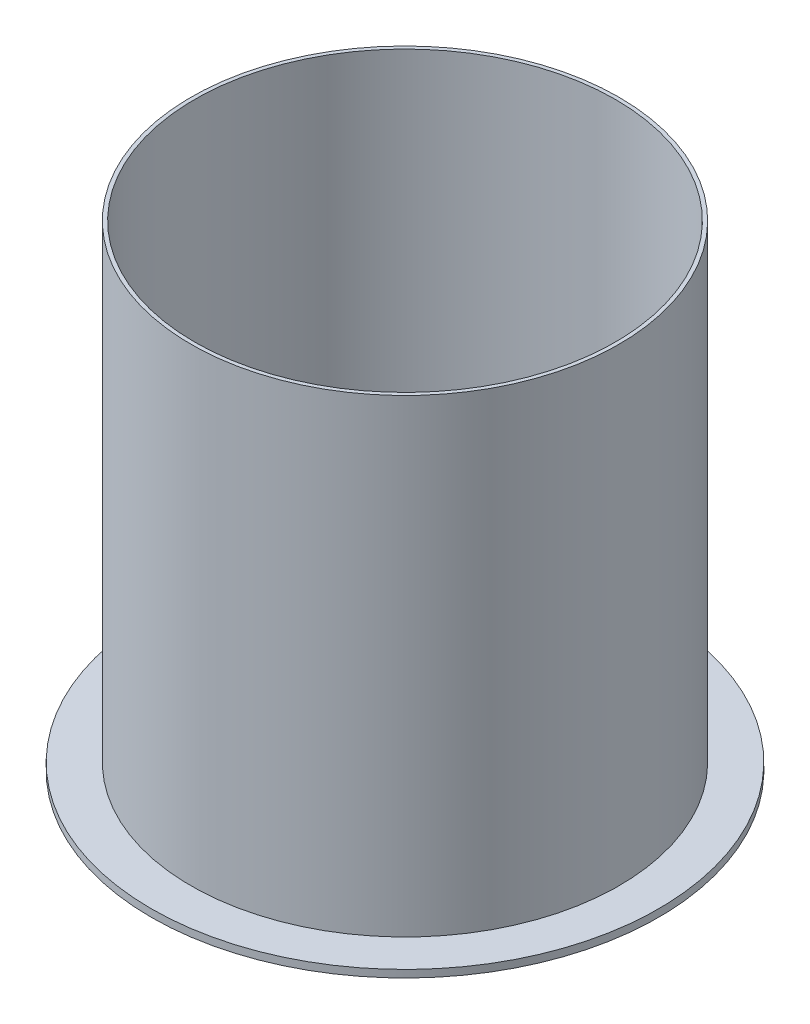
ISO-10303-21;
HEADER;
FILE_DESCRIPTION(('STEP AP214'),'2;1');
FILE_NAME('part.step','',(''),(''),'','','');
FILE_SCHEMA(('AUTOMOTIVE_DESIGN { 1 0 10303 214 1 1 1 1 }'));
ENDSEC;
DATA;
#1=APPLICATION_CONTEXT('core data for automotive mechanical design processes');
#2=APPLICATION_PROTOCOL_DEFINITION('international standard','automotive_design',2000,#1);
#3=PRODUCT_CONTEXT('',#1,'mechanical');
#4=PRODUCT('Part','Part','',(#3));
#5=PRODUCT_RELATED_PRODUCT_CATEGORY('part','',(#4));
#6=PRODUCT_DEFINITION_FORMATION('','',#4);
#7=PRODUCT_DEFINITION_CONTEXT('part definition',#1,'design');
#8=PRODUCT_DEFINITION('design','',#6,#7);
#9=PRODUCT_DEFINITION_SHAPE('','',#8);
#10=(LENGTH_UNIT() NAMED_UNIT(*) SI_UNIT(.MILLI.,.METRE.));
#11=(NAMED_UNIT(*) PLANE_ANGLE_UNIT() SI_UNIT($,.RADIAN.));
#12=(NAMED_UNIT(*) SI_UNIT($,.STERADIAN.) SOLID_ANGLE_UNIT());
#13=UNCERTAINTY_MEASURE_WITH_UNIT(LENGTH_MEASURE(1.E-05),#10,'distance_accuracy_value','');
#14=(GEOMETRIC_REPRESENTATION_CONTEXT(3) GLOBAL_UNCERTAINTY_ASSIGNED_CONTEXT((#13)) GLOBAL_UNIT_ASSIGNED_CONTEXT((#10,
#11,#12)) REPRESENTATION_CONTEXT('',''));
#15=CARTESIAN_POINT('',(0.,0.,0.));
#16=DIRECTION('',(0.,0.,1.));
#17=DIRECTION('',(1.,0.,0.));
#18=AXIS2_PLACEMENT_3D('',#15,#16,#17);
#19=CARTESIAN_POINT('',(0.,2438.4,0.));
#20=DIRECTION('',(0.,1.,0.));
#21=DIRECTION('',(0.,0.,1.));
#22=AXIS2_PLACEMENT_3D('',#19,#20,#21);
#23=PLANE('',#22);
#24=CARTESIAN_POINT('',(0.,2438.4,0.));
#25=DIRECTION('',(0.,1.,0.));
#26=DIRECTION('',(0.,0.,1.));
#27=AXIS2_PLACEMENT_3D('',#24,#25,#26);
#28=CIRCLE('',#27,1095.375);
#29=CARTESIAN_POINT('',(0.,2438.4,-1095.375));
#30=VERTEX_POINT('',#29);
#31=EDGE_CURVE('E10',#30,#30,#28,.T.);
#32=ORIENTED_EDGE('',*,*,#31,.T.);
#33=EDGE_LOOP('',(#32));
#34=FACE_BOUND('',#33,.T.);
#35=CARTESIAN_POINT('',(0.,2438.4,0.));
#36=DIRECTION('',(0.,1.,0.));
#37=DIRECTION('',(0.,0.,1.));
#38=AXIS2_PLACEMENT_3D('',#35,#36,#37);
#39=CIRCLE('',#38,1076.325);
#40=CARTESIAN_POINT('',(0.,2438.4,-1076.325));
#41=VERTEX_POINT('',#40);
#42=EDGE_CURVE('E44',#41,#41,#39,.T.);
#43=ORIENTED_EDGE('',*,*,#42,.F.);
#44=EDGE_LOOP('',(#43));
#45=FACE_BOUND('',#44,.T.);
#46=ADVANCED_FACE('F37',(#34,#45),#23,.T.);
#47=CARTESIAN_POINT('',(0.,0.,0.));
#48=DIRECTION('',(0.,1.,0.));
#49=DIRECTION('',(0.,0.,1.));
#50=AXIS2_PLACEMENT_3D('',#47,#48,#49);
#51=PLANE('',#50);
#52=CARTESIAN_POINT('',(0.,0.,0.));
#53=DIRECTION('',(0.,1.,0.));
#54=DIRECTION('',(0.,0.,1.));
#55=AXIS2_PLACEMENT_3D('',#52,#53,#54);
#56=CIRCLE('',#55,1076.325);
#57=CARTESIAN_POINT('',(0.,0.,-1076.325));
#58=VERTEX_POINT('',#57);
#59=EDGE_CURVE('E48',#58,#58,#56,.T.);
#60=ORIENTED_EDGE('',*,*,#59,.T.);
#61=EDGE_LOOP('',(#60));
#62=FACE_BOUND('',#61,.T.);
#63=CARTESIAN_POINT('',(0.,0.,0.));
#64=DIRECTION('',(0.,1.,0.));
#65=DIRECTION('',(0.,0.,1.));
#66=AXIS2_PLACEMENT_3D('',#63,#64,#65);
#67=CIRCLE('',#66,1298.575);
#68=CARTESIAN_POINT('',(0.,0.,-1298.575));
#69=VERTEX_POINT('',#68);
#70=EDGE_CURVE('E58',#69,#69,#67,.T.);
#71=ORIENTED_EDGE('',*,*,#70,.F.);
#72=EDGE_LOOP('',(#71));
#73=FACE_BOUND('',#72,.T.);
#74=ADVANCED_FACE('F73',(#62,#73),#51,.F.);
#75=CARTESIAN_POINT('',(0.,2438.4,0.));
#76=DIRECTION('',(0.,-1.,0.));
#77=DIRECTION('',(0.,0.,-1.));
#78=AXIS2_PLACEMENT_3D('',#75,#76,#77);
#79=CYLINDRICAL_SURFACE('',#78,1095.375);
#80=CARTESIAN_POINT('',(0.,38.1,0.));
#81=DIRECTION('',(0.,1.,0.));
#82=DIRECTION('',(0.,0.,1.));
#83=AXIS2_PLACEMENT_3D('',#80,#81,#82);
#84=CIRCLE('',#83,1095.375);
#85=CARTESIAN_POINT('',(0.,38.1,-1095.375));
#86=VERTEX_POINT('',#85);
#87=EDGE_CURVE('E53',#86,#86,#84,.T.);
#88=CARTESIAN_POINT('',(0.,38.1,-1095.375));
#89=CARTESIAN_POINT('',(0.,63.103125,-1095.375));
#90=CARTESIAN_POINT('',(0.,88.10625,-1095.375));
#91=CARTESIAN_POINT('',(0.,138.1125,-1095.375));
#92=CARTESIAN_POINT('',(0.,163.115625,-1095.375));
#93=CARTESIAN_POINT('',(0.,213.121875,-1095.375));
#94=CARTESIAN_POINT('',(0.,238.125,-1095.375));
#95=CARTESIAN_POINT('',(0.,288.13125,-1095.375));
#96=CARTESIAN_POINT('',(0.,313.134375,-1095.375));
#97=CARTESIAN_POINT('',(0.,363.140625,-1095.375));
#98=CARTESIAN_POINT('',(0.,388.14375,-1095.375));
#99=CARTESIAN_POINT('',(0.,438.15,-1095.375));
#100=CARTESIAN_POINT('',(0.,463.153125,-1095.375));
#101=CARTESIAN_POINT('',(0.,513.159375,-1095.375));
#102=CARTESIAN_POINT('',(0.,538.1625,-1095.375));
#103=CARTESIAN_POINT('',(0.,588.16875,-1095.375));
#104=CARTESIAN_POINT('',(0.,613.171875,-1095.375));
#105=CARTESIAN_POINT('',(0.,663.178125,-1095.375));
#106=CARTESIAN_POINT('',(0.,688.18125,-1095.375));
#107=CARTESIAN_POINT('',(0.,738.1875,-1095.375));
#108=CARTESIAN_POINT('',(0.,763.190625,-1095.375));
#109=CARTESIAN_POINT('',(0.,813.196875,-1095.375));
#110=CARTESIAN_POINT('',(0.,838.2,-1095.375));
#111=CARTESIAN_POINT('',(0.,888.20625,-1095.375));
#112=CARTESIAN_POINT('',(0.,913.209375,-1095.375));
#113=CARTESIAN_POINT('',(0.,963.215625,-1095.375));
#114=CARTESIAN_POINT('',(0.,988.21875,-1095.375));
#115=CARTESIAN_POINT('',(0.,1038.225,-1095.375));
#116=CARTESIAN_POINT('',(0.,1063.228125,-1095.375));
#117=CARTESIAN_POINT('',(0.,1113.234375,-1095.375));
#118=CARTESIAN_POINT('',(0.,1138.2375,-1095.375));
#119=CARTESIAN_POINT('',(0.,1188.24375,-1095.375));
#120=CARTESIAN_POINT('',(0.,1213.246875,-1095.375));
#121=CARTESIAN_POINT('',(0.,1263.253125,-1095.375));
#122=CARTESIAN_POINT('',(0.,1288.25625,-1095.375));
#123=CARTESIAN_POINT('',(0.,1338.2625,-1095.375));
#124=CARTESIAN_POINT('',(0.,1363.265625,-1095.375));
#125=CARTESIAN_POINT('',(0.,1413.271875,-1095.375));
#126=CARTESIAN_POINT('',(0.,1438.275,-1095.375));
#127=CARTESIAN_POINT('',(0.,1488.28125,-1095.375));
#128=CARTESIAN_POINT('',(0.,1513.284375,-1095.375));
#129=CARTESIAN_POINT('',(0.,1563.290625,-1095.375));
#130=CARTESIAN_POINT('',(0.,1588.29375,-1095.375));
#131=CARTESIAN_POINT('',(0.,1638.3,-1095.375));
#132=CARTESIAN_POINT('',(0.,1663.303125,-1095.375));
#133=CARTESIAN_POINT('',(0.,1713.309375,-1095.375));
#134=CARTESIAN_POINT('',(0.,1738.3125,-1095.375));
#135=CARTESIAN_POINT('',(0.,1788.31875,-1095.375));
#136=CARTESIAN_POINT('',(0.,1813.321875,-1095.375));
#137=CARTESIAN_POINT('',(0.,1863.328125,-1095.375));
#138=CARTESIAN_POINT('',(0.,1888.33125,-1095.375));
#139=CARTESIAN_POINT('',(0.,1938.3375,-1095.375));
#140=CARTESIAN_POINT('',(0.,1963.340625,-1095.375));
#141=CARTESIAN_POINT('',(0.,2013.346875,-1095.375));
#142=CARTESIAN_POINT('',(0.,2038.35,-1095.375));
#143=CARTESIAN_POINT('',(0.,2088.35625,-1095.375));
#144=CARTESIAN_POINT('',(0.,2113.359375,-1095.375));
#145=CARTESIAN_POINT('',(0.,2163.365625,-1095.375));
#146=CARTESIAN_POINT('',(0.,2188.36875,-1095.375));
#147=CARTESIAN_POINT('',(0.,2238.375,-1095.375));
#148=CARTESIAN_POINT('',(0.,2263.378125,-1095.375));
#149=CARTESIAN_POINT('',(0.,2313.384375,-1095.375));
#150=CARTESIAN_POINT('',(0.,2338.3875,-1095.375));
#151=CARTESIAN_POINT('',(0.,2388.39375,-1095.375));
#152=CARTESIAN_POINT('',(0.,2413.396875,-1095.375));
#153=CARTESIAN_POINT('',(0.,2438.4,-1095.375));
#154=B_SPLINE_CURVE_WITH_KNOTS('',3,(#88,#89,#90,#91,#92,#93,#94,#95,#96,#97,#98,#99,#100,#101,
#102,#103,#104,#105,#106,#107,#108,#109,#110,#111,#112,#113,#114,#115,#116,#117,#118,#119,#120,
#121,#122,#123,#124,#125,#126,#127,#128,#129,#130,#131,#132,#133,#134,#135,#136,#137,#138,#139,
#140,#141,#142,#143,#144,#145,#146,#147,#148,#149,#150,#151,#152,#153),.UNSPECIFIED.,.F.,.F.,(4,
2,2,2,2,2,2,2,2,2,2,2,2,2,2,2,2,2,2,2,2,2,2,2,2,2,2,2,2,2,2,2,4),(0.,75.009375,150.01875,
225.028125,300.0375,375.046875,450.05625,525.065625,600.075,675.084375,750.09375,825.103125,
900.1125,975.121875,1050.13125,1125.140625,1200.15,1275.159375,1350.16875,1425.178125,1500.1875,
1575.196875,1650.20625,1725.215625,1800.225,1875.234375,1950.24375,2025.253125,2100.2625,
2175.271875,2250.28125,2325.290625,2400.3),.UNSPECIFIED.);
#155=EDGE_CURVE('BSEAM39',#86,#30,#154,.T.);
#156=ORIENTED_EDGE('',*,*,#87,.T.);
#157=ORIENTED_EDGE('',*,*,#31,.F.);
#158=ORIENTED_EDGE('',*,*,#155,.T.);
#159=ORIENTED_EDGE('',*,*,#155,.F.);
#160=EDGE_LOOP('',(#156,#158,#157,#159));
#161=FACE_BOUND('',#160,.T.);
#162=ADVANCED_FACE('F39',(#161),#79,.T.);
#163=CARTESIAN_POINT('',(0.,2438.4,0.));
#164=DIRECTION('',(0.,-1.,0.));
#165=DIRECTION('',(0.,0.,-1.));
#166=AXIS2_PLACEMENT_3D('',#163,#164,#165);
#167=CYLINDRICAL_SURFACE('',#166,1076.325);
#168=CARTESIAN_POINT('',(0.,2438.4,-1076.325));
#169=CARTESIAN_POINT('',(0.,2413.,-1076.325));
#170=CARTESIAN_POINT('',(0.,2387.6,-1076.325));
#171=CARTESIAN_POINT('',(0.,2336.8,-1076.325));
#172=CARTESIAN_POINT('',(0.,2311.4,-1076.325));
#173=CARTESIAN_POINT('',(0.,2260.6,-1076.325));
#174=CARTESIAN_POINT('',(0.,2235.2,-1076.325));
#175=CARTESIAN_POINT('',(0.,2184.4,-1076.325));
#176=CARTESIAN_POINT('',(0.,2159.,-1076.325));
#177=CARTESIAN_POINT('',(0.,2108.2,-1076.325));
#178=CARTESIAN_POINT('',(0.,2082.8,-1076.325));
#179=CARTESIAN_POINT('',(0.,2032.,-1076.325));
#180=CARTESIAN_POINT('',(0.,2006.6,-1076.325));
#181=CARTESIAN_POINT('',(0.,1955.8,-1076.325));
#182=CARTESIAN_POINT('',(0.,1930.4,-1076.325));
#183=CARTESIAN_POINT('',(0.,1879.6,-1076.325));
#184=CARTESIAN_POINT('',(0.,1854.2,-1076.325));
#185=CARTESIAN_POINT('',(0.,1803.4,-1076.325));
#186=CARTESIAN_POINT('',(0.,1778.,-1076.325));
#187=CARTESIAN_POINT('',(0.,1727.2,-1076.325));
#188=CARTESIAN_POINT('',(0.,1701.8,-1076.325));
#189=CARTESIAN_POINT('',(0.,1651.,-1076.325));
#190=CARTESIAN_POINT('',(0.,1625.6,-1076.325));
#191=CARTESIAN_POINT('',(0.,1574.8,-1076.325));
#192=CARTESIAN_POINT('',(0.,1549.4,-1076.325));
#193=CARTESIAN_POINT('',(0.,1498.6,-1076.325));
#194=CARTESIAN_POINT('',(0.,1473.2,-1076.325));
#195=CARTESIAN_POINT('',(0.,1422.4,-1076.325));
#196=CARTESIAN_POINT('',(0.,1397.,-1076.325));
#197=CARTESIAN_POINT('',(0.,1346.2,-1076.325));
#198=CARTESIAN_POINT('',(0.,1320.8,-1076.325));
#199=CARTESIAN_POINT('',(0.,1270.,-1076.325));
#200=CARTESIAN_POINT('',(0.,1244.6,-1076.325));
#201=CARTESIAN_POINT('',(0.,1193.8,-1076.325));
#202=CARTESIAN_POINT('',(0.,1168.4,-1076.325));
#203=CARTESIAN_POINT('',(0.,1117.6,-1076.325));
#204=CARTESIAN_POINT('',(0.,1092.2,-1076.325));
#205=CARTESIAN_POINT('',(0.,1041.4,-1076.325));
#206=CARTESIAN_POINT('',(0.,1016.,-1076.325));
#207=CARTESIAN_POINT('',(0.,965.2,-1076.325));
#208=CARTESIAN_POINT('',(0.,939.8,-1076.325));
#209=CARTESIAN_POINT('',(0.,889.,-1076.325));
#210=CARTESIAN_POINT('',(0.,863.6,-1076.325));
#211=CARTESIAN_POINT('',(0.,812.8,-1076.325));
#212=CARTESIAN_POINT('',(0.,787.4,-1076.325));
#213=CARTESIAN_POINT('',(0.,736.6,-1076.325));
#214=CARTESIAN_POINT('',(0.,711.2,-1076.325));
#215=CARTESIAN_POINT('',(0.,660.4,-1076.325));
#216=CARTESIAN_POINT('',(0.,635.,-1076.325));
#217=CARTESIAN_POINT('',(0.,584.2,-1076.325));
#218=CARTESIAN_POINT('',(0.,558.8,-1076.325));
#219=CARTESIAN_POINT('',(0.,508.,-1076.325));
#220=CARTESIAN_POINT('',(0.,482.6,-1076.325));
#221=CARTESIAN_POINT('',(0.,431.8,-1076.325));
#222=CARTESIAN_POINT('',(0.,406.4,-1076.325));
#223=CARTESIAN_POINT('',(0.,355.6,-1076.325));
#224=CARTESIAN_POINT('',(0.,330.2,-1076.325));
#225=CARTESIAN_POINT('',(0.,279.4,-1076.325));
#226=CARTESIAN_POINT('',(0.,254.,-1076.325));
#227=CARTESIAN_POINT('',(0.,203.2,-1076.325));
#228=CARTESIAN_POINT('',(0.,177.8,-1076.325));
#229=CARTESIAN_POINT('',(0.,127.,-1076.325));
#230=CARTESIAN_POINT('',(0.,101.6,-1076.325));
#231=CARTESIAN_POINT('',(0.,50.8,-1076.325));
#232=CARTESIAN_POINT('',(0.,25.4,-1076.325));
#233=CARTESIAN_POINT('',(0.,0.,-1076.325));
#234=B_SPLINE_CURVE_WITH_KNOTS('',3,(#168,#169,#170,#171,#172,#173,#174,#175,#176,#177,#178,
#179,#180,#181,#182,#183,#184,#185,#186,#187,#188,#189,#190,#191,#192,#193,#194,#195,#196,#197,
#198,#199,#200,#201,#202,#203,#204,#205,#206,#207,#208,#209,#210,#211,#212,#213,#214,#215,#216,
#217,#218,#219,#220,#221,#222,#223,#224,#225,#226,#227,#228,#229,#230,#231,#232,#233),
.UNSPECIFIED.,.F.,.F.,(4,2,2,2,2,2,2,2,2,2,2,2,2,2,2,2,2,2,2,2,2,2,2,2,2,2,2,2,2,2,2,2,4),(0.,
76.1999999999996,152.4,228.6,304.8,381.,457.2,533.4,609.6,685.8,762.,838.2,914.4,990.6,1066.8,
1143.,1219.2,1295.4,1371.6,1447.8,1524.,1600.2,1676.4,1752.6,1828.8,1905.,1981.2,2057.4,2133.6,
2209.8,2286.,2362.2,2438.4),.UNSPECIFIED.);
#235=EDGE_CURVE('BSEAM80',#41,#58,#234,.T.);
#236=ORIENTED_EDGE('',*,*,#42,.T.);
#237=ORIENTED_EDGE('',*,*,#59,.F.);
#238=ORIENTED_EDGE('',*,*,#235,.T.);
#239=ORIENTED_EDGE('',*,*,#235,.F.);
#240=EDGE_LOOP('',(#236,#238,#237,#239));
#241=FACE_BOUND('',#240,.T.);
#242=ADVANCED_FACE('F80',(#241),#167,.F.);
#243=CARTESIAN_POINT('',(0.,38.1,0.));
#244=DIRECTION('',(0.,1.,0.));
#245=DIRECTION('',(0.,0.,1.));
#246=AXIS2_PLACEMENT_3D('',#243,#244,#245);
#247=PLANE('',#246);
#248=CARTESIAN_POINT('',(0.,38.1,0.));
#249=DIRECTION('',(0.,1.,0.));
#250=DIRECTION('',(0.,0.,1.));
#251=AXIS2_PLACEMENT_3D('',#248,#249,#250);
#252=CIRCLE('',#251,1298.575);
#253=CARTESIAN_POINT('',(0.,38.1,-1298.575));
#254=VERTEX_POINT('',#253);
#255=EDGE_CURVE('E57',#254,#254,#252,.T.);
#256=ORIENTED_EDGE('',*,*,#255,.T.);
#257=EDGE_LOOP('',(#256));
#258=FACE_BOUND('',#257,.T.);
#259=ORIENTED_EDGE('',*,*,#87,.F.);
#260=EDGE_LOOP('',(#259));
#261=FACE_BOUND('',#260,.T.);
#262=ADVANCED_FACE('F64',(#258,#261),#247,.T.);
#263=CARTESIAN_POINT('',(0.,38.1,0.));
#264=DIRECTION('',(0.,-1.,0.));
#265=DIRECTION('',(0.,0.,-1.));
#266=AXIS2_PLACEMENT_3D('',#263,#264,#265);
#267=CYLINDRICAL_SURFACE('',#266,1298.575);
#268=CARTESIAN_POINT('',(0.,38.1,-1298.575));
#269=CARTESIAN_POINT('',(0.,37.703125,-1298.575));
#270=CARTESIAN_POINT('',(0.,37.30625,-1298.575));
#271=CARTESIAN_POINT('',(0.,36.5125,-1298.575));
#272=CARTESIAN_POINT('',(0.,36.115625,-1298.575));
#273=CARTESIAN_POINT('',(0.,35.321875,-1298.575));
#274=CARTESIAN_POINT('',(0.,34.925,-1298.575));
#275=CARTESIAN_POINT('',(0.,34.13125,-1298.575));
#276=CARTESIAN_POINT('',(0.,33.734375,-1298.575));
#277=CARTESIAN_POINT('',(0.,32.940625,-1298.575));
#278=CARTESIAN_POINT('',(0.,32.54375,-1298.575));
#279=CARTESIAN_POINT('',(0.,31.75,-1298.575));
#280=CARTESIAN_POINT('',(0.,31.353125,-1298.575));
#281=CARTESIAN_POINT('',(0.,30.559375,-1298.575));
#282=CARTESIAN_POINT('',(0.,30.1625,-1298.575));
#283=CARTESIAN_POINT('',(0.,29.36875,-1298.575));
#284=CARTESIAN_POINT('',(0.,28.971875,-1298.575));
#285=CARTESIAN_POINT('',(0.,28.178125,-1298.575));
#286=CARTESIAN_POINT('',(0.,27.78125,-1298.575));
#287=CARTESIAN_POINT('',(0.,26.9875,-1298.575));
#288=CARTESIAN_POINT('',(0.,26.590625,-1298.575));
#289=CARTESIAN_POINT('',(0.,25.796875,-1298.575));
#290=CARTESIAN_POINT('',(0.,25.4,-1298.575));
#291=CARTESIAN_POINT('',(0.,24.60625,-1298.575));
#292=CARTESIAN_POINT('',(0.,24.209375,-1298.575));
#293=CARTESIAN_POINT('',(0.,23.415625,-1298.575));
#294=CARTESIAN_POINT('',(0.,23.01875,-1298.575));
#295=CARTESIAN_POINT('',(0.,22.225,-1298.575));
#296=CARTESIAN_POINT('',(0.,21.828125,-1298.575));
#297=CARTESIAN_POINT('',(0.,21.034375,-1298.575));
#298=CARTESIAN_POINT('',(0.,20.6375,-1298.575));
#299=CARTESIAN_POINT('',(0.,19.84375,-1298.575));
#300=CARTESIAN_POINT('',(0.,19.446875,-1298.575));
#301=CARTESIAN_POINT('',(0.,18.653125,-1298.575));
#302=CARTESIAN_POINT('',(0.,18.25625,-1298.575));
#303=CARTESIAN_POINT('',(0.,17.4625,-1298.575));
#304=CARTESIAN_POINT('',(0.,17.065625,-1298.575));
#305=CARTESIAN_POINT('',(0.,16.271875,-1298.575));
#306=CARTESIAN_POINT('',(0.,15.875,-1298.575));
#307=CARTESIAN_POINT('',(0.,15.08125,-1298.575));
#308=CARTESIAN_POINT('',(0.,14.684375,-1298.575));
#309=CARTESIAN_POINT('',(0.,13.890625,-1298.575));
#310=CARTESIAN_POINT('',(0.,13.49375,-1298.575));
#311=CARTESIAN_POINT('',(0.,12.7,-1298.575));
#312=CARTESIAN_POINT('',(0.,12.303125,-1298.575));
#313=CARTESIAN_POINT('',(0.,11.509375,-1298.575));
#314=CARTESIAN_POINT('',(0.,11.1125,-1298.575));
#315=CARTESIAN_POINT('',(0.,10.31875,-1298.575));
#316=CARTESIAN_POINT('',(0.,9.921875,-1298.575));
#317=CARTESIAN_POINT('',(0.,9.128125,-1298.575));
#318=CARTESIAN_POINT('',(0.,8.73125,-1298.575));
#319=CARTESIAN_POINT('',(0.,7.9375,-1298.575));
#320=CARTESIAN_POINT('',(0.,7.540625,-1298.575));
#321=CARTESIAN_POINT('',(0.,6.746875,-1298.575));
#322=CARTESIAN_POINT('',(0.,6.35,-1298.575));
#323=CARTESIAN_POINT('',(0.,5.55625,-1298.575));
#324=CARTESIAN_POINT('',(0.,5.159375,-1298.575));
#325=CARTESIAN_POINT('',(0.,4.365625,-1298.575));
#326=CARTESIAN_POINT('',(0.,3.96875,-1298.575));
#327=CARTESIAN_POINT('',(0.,3.175,-1298.575));
#328=CARTESIAN_POINT('',(0.,2.778125,-1298.575));
#329=CARTESIAN_POINT('',(0.,1.984375,-1298.575));
#330=CARTESIAN_POINT('',(0.,1.5875,-1298.575));
#331=CARTESIAN_POINT('',(0.,0.79375,-1298.575));
#332=CARTESIAN_POINT('',(0.,0.396875,-1298.575));
#333=CARTESIAN_POINT('',(0.,0.,-1298.575));
#334=B_SPLINE_CURVE_WITH_KNOTS('',3,(#268,#269,#270,#271,#272,#273,#274,#275,#276,#277,#278,
#279,#280,#281,#282,#283,#284,#285,#286,#287,#288,#289,#290,#291,#292,#293,#294,#295,#296,#297,
#298,#299,#300,#301,#302,#303,#304,#305,#306,#307,#308,#309,#310,#311,#312,#313,#314,#315,#316,
#317,#318,#319,#320,#321,#322,#323,#324,#325,#326,#327,#328,#329,#330,#331,#332,#333),
.UNSPECIFIED.,.F.,.F.,(4,2,2,2,2,2,2,2,2,2,2,2,2,2,2,2,2,2,2,2,2,2,2,2,2,2,2,2,2,2,2,2,4),(0.,
1.19062499999999,2.38124999999999,3.571875,4.7625,5.953125,7.14375,8.33437499999999,9.525,
10.715625,11.90625,13.096875,14.2875,15.478125,16.66875,17.859375,19.05,20.240625,21.43125,
22.621875,23.8125,25.003125,26.19375,27.384375,28.575,29.765625,30.95625,32.146875,33.3375,
34.528125,35.71875,36.909375,38.1),.UNSPECIFIED.);
#335=EDGE_CURVE('BSEAM67',#254,#69,#334,.T.);
#336=ORIENTED_EDGE('',*,*,#255,.F.);
#337=ORIENTED_EDGE('',*,*,#70,.T.);
#338=ORIENTED_EDGE('',*,*,#335,.T.);
#339=ORIENTED_EDGE('',*,*,#335,.F.);
#340=EDGE_LOOP('',(#336,#338,#337,#339));
#341=FACE_BOUND('',#340,.T.);
#342=ADVANCED_FACE('F67',(#341),#267,.T.);
#343=CLOSED_SHELL('',(#46,#74,#162,#242,#262,#342));
#344=MANIFOLD_SOLID_BREP('B2',#343);
#345=ADVANCED_BREP_SHAPE_REPRESENTATION('',(#18,#344),#14);
#346=SHAPE_DEFINITION_REPRESENTATION(#9,#345);
ENDSEC;
END-ISO-10303-21;
